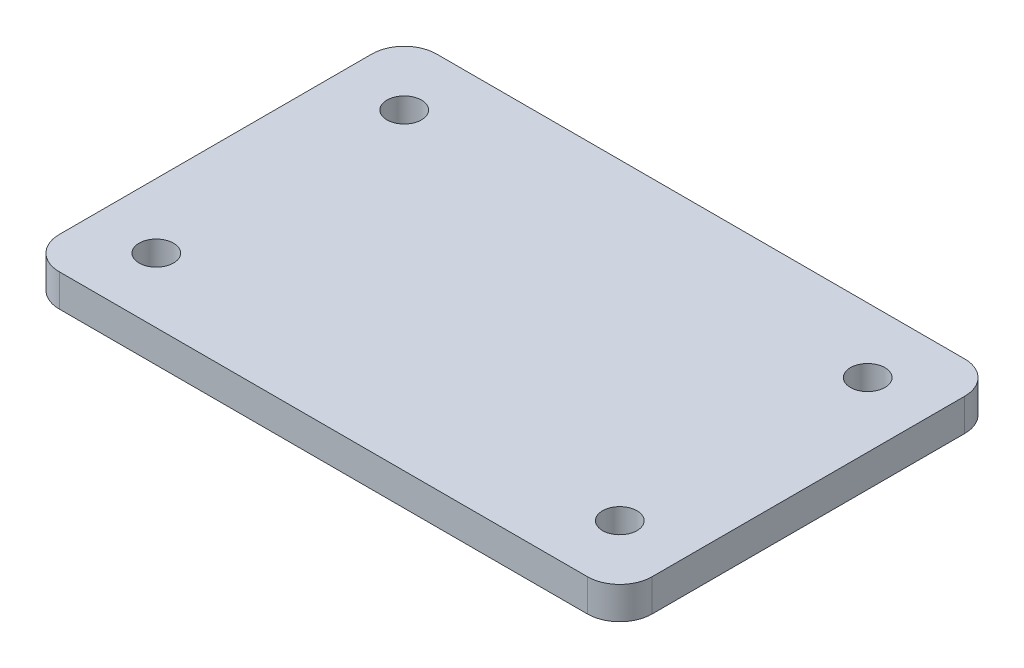
ISO-10303-21;
HEADER;
FILE_DESCRIPTION(('STEP AP214'),'2;1');
FILE_NAME('part.step','',(''),(''),'','','');
FILE_SCHEMA(('AUTOMOTIVE_DESIGN { 1 0 10303 214 1 1 1 1 }'));
ENDSEC;
DATA;
#1=APPLICATION_CONTEXT('core data for automotive mechanical design processes');
#2=APPLICATION_PROTOCOL_DEFINITION('international standard','automotive_design',2000,#1);
#3=PRODUCT_CONTEXT('',#1,'mechanical');
#4=PRODUCT('Part','Part','',(#3));
#5=PRODUCT_RELATED_PRODUCT_CATEGORY('part','',(#4));
#6=PRODUCT_DEFINITION_FORMATION('','',#4);
#7=PRODUCT_DEFINITION_CONTEXT('part definition',#1,'design');
#8=PRODUCT_DEFINITION('design','',#6,#7);
#9=PRODUCT_DEFINITION_SHAPE('','',#8);
#10=(LENGTH_UNIT() NAMED_UNIT(*) SI_UNIT(.MILLI.,.METRE.));
#11=(NAMED_UNIT(*) PLANE_ANGLE_UNIT() SI_UNIT($,.RADIAN.));
#12=(NAMED_UNIT(*) SI_UNIT($,.STERADIAN.) SOLID_ANGLE_UNIT());
#13=UNCERTAINTY_MEASURE_WITH_UNIT(LENGTH_MEASURE(1.E-05),#10,'distance_accuracy_value','');
#14=(GEOMETRIC_REPRESENTATION_CONTEXT(3) GLOBAL_UNCERTAINTY_ASSIGNED_CONTEXT((#13)) GLOBAL_UNIT_ASSIGNED_CONTEXT((#10,
#11,#12)) REPRESENTATION_CONTEXT('',''));
#15=CARTESIAN_POINT('',(0.,0.,0.));
#16=DIRECTION('',(0.,0.,1.));
#17=DIRECTION('',(1.,0.,0.));
#18=AXIS2_PLACEMENT_3D('',#15,#16,#17);
#19=CARTESIAN_POINT('',(0.,3.,0.));
#20=DIRECTION('',(1.,0.,0.));
#21=DIRECTION('',(0.,0.,-1.));
#22=AXIS2_PLACEMENT_3D('',#19,#20,#21);
#23=PLANE('',#22);
#24=DIRECTION('',(0.,0.,1.));
#25=VECTOR('',#24,1.);
#26=CARTESIAN_POINT('',(0.,3.,0.));
#27=LINE('',#26,#25);
#28=CARTESIAN_POINT('',(0.,3.,-32.));
#29=VERTEX_POINT('',#28);
#30=CARTESIAN_POINT('',(0.,3.,-3.));
#31=VERTEX_POINT('',#30);
#32=EDGE_CURVE('E135',#29,#31,#27,.T.);
#33=ORIENTED_EDGE('',*,*,#32,.F.);
#34=DIRECTION('',(0.,-1.,0.));
#35=VECTOR('',#34,1.);
#36=CARTESIAN_POINT('',(0.,3.,-32.));
#37=LINE('',#36,#35);
#38=CARTESIAN_POINT('',(0.,0.,-32.));
#39=VERTEX_POINT('',#38);
#40=EDGE_CURVE('E161',#29,#39,#37,.T.);
#41=ORIENTED_EDGE('',*,*,#40,.T.);
#42=DIRECTION('',(0.,0.,1.));
#43=VECTOR('',#42,1.);
#44=CARTESIAN_POINT('',(0.,0.,0.));
#45=LINE('',#44,#43);
#46=CARTESIAN_POINT('',(0.,0.,-3.));
#47=VERTEX_POINT('',#46);
#48=EDGE_CURVE('E167',#39,#47,#45,.T.);
#49=ORIENTED_EDGE('',*,*,#48,.T.);
#50=DIRECTION('',(0.,-1.,0.));
#51=VECTOR('',#50,1.);
#52=CARTESIAN_POINT('',(0.,3.,-3.));
#53=LINE('',#52,#51);
#54=EDGE_CURVE('E159',#47,#31,#53,.F.);
#55=ORIENTED_EDGE('',*,*,#54,.T.);
#56=EDGE_LOOP('',(#33,#41,#49,#55));
#57=FACE_BOUND('',#56,.T.);
#58=ADVANCED_FACE('F43',(#57),#23,.F.);
#59=CARTESIAN_POINT('',(0.,3.,0.));
#60=DIRECTION('',(0.,0.,-1.));
#61=DIRECTION('',(-1.,0.,0.));
#62=AXIS2_PLACEMENT_3D('',#59,#60,#61);
#63=PLANE('',#62);
#64=DIRECTION('',(1.,0.,0.));
#65=VECTOR('',#64,1.);
#66=CARTESIAN_POINT('',(0.,3.,0.));
#67=LINE('',#66,#65);
#68=CARTESIAN_POINT('',(3.,3.,0.));
#69=VERTEX_POINT('',#68);
#70=CARTESIAN_POINT('',(52.,3.,0.));
#71=VERTEX_POINT('',#70);
#72=EDGE_CURVE('E138',#69,#71,#67,.T.);
#73=ORIENTED_EDGE('',*,*,#72,.F.);
#74=DIRECTION('',(0.,-1.,0.));
#75=VECTOR('',#74,1.);
#76=CARTESIAN_POINT('',(3.,3.,0.));
#77=LINE('',#76,#75);
#78=CARTESIAN_POINT('',(3.,0.,0.));
#79=VERTEX_POINT('',#78);
#80=EDGE_CURVE('E11',#69,#79,#77,.T.);
#81=ORIENTED_EDGE('',*,*,#80,.T.);
#82=DIRECTION('',(1.,0.,0.));
#83=VECTOR('',#82,1.);
#84=CARTESIAN_POINT('',(0.,0.,0.));
#85=LINE('',#84,#83);
#86=CARTESIAN_POINT('',(52.,0.,0.));
#87=VERTEX_POINT('',#86);
#88=EDGE_CURVE('E140',#79,#87,#85,.T.);
#89=ORIENTED_EDGE('',*,*,#88,.T.);
#90=DIRECTION('',(0.,-1.,0.));
#91=VECTOR('',#90,1.);
#92=CARTESIAN_POINT('',(52.,3.,0.));
#93=LINE('',#92,#91);
#94=EDGE_CURVE('E51',#87,#71,#93,.F.);
#95=ORIENTED_EDGE('',*,*,#94,.T.);
#96=EDGE_LOOP('',(#73,#81,#89,#95));
#97=FACE_BOUND('',#96,.T.);
#98=ADVANCED_FACE('F218',(#97),#63,.F.);
#99=CARTESIAN_POINT('',(55.,3.,0.));
#100=DIRECTION('',(-1.,0.,0.));
#101=DIRECTION('',(0.,0.,1.));
#102=AXIS2_PLACEMENT_3D('',#99,#100,#101);
#103=PLANE('',#102);
#104=DIRECTION('',(0.,0.,-1.));
#105=VECTOR('',#104,1.);
#106=CARTESIAN_POINT('',(55.,0.,0.));
#107=LINE('',#106,#105);
#108=CARTESIAN_POINT('',(55.,0.,-3.));
#109=VERTEX_POINT('',#108);
#110=CARTESIAN_POINT('',(55.,0.,-32.));
#111=VERTEX_POINT('',#110);
#112=EDGE_CURVE('E136',#109,#111,#107,.T.);
#113=ORIENTED_EDGE('',*,*,#112,.T.);
#114=DIRECTION('',(0.,-1.,0.));
#115=VECTOR('',#114,1.);
#116=CARTESIAN_POINT('',(55.,3.,-32.));
#117=LINE('',#116,#115);
#118=CARTESIAN_POINT('',(55.,3.,-32.));
#119=VERTEX_POINT('',#118);
#120=EDGE_CURVE('E114',#111,#119,#117,.F.);
#121=ORIENTED_EDGE('',*,*,#120,.T.);
#122=DIRECTION('',(0.,0.,-1.));
#123=VECTOR('',#122,1.);
#124=CARTESIAN_POINT('',(55.,3.,0.));
#125=LINE('',#124,#123);
#126=CARTESIAN_POINT('',(55.,3.,-3.));
#127=VERTEX_POINT('',#126);
#128=EDGE_CURVE('E179',#127,#119,#125,.T.);
#129=ORIENTED_EDGE('',*,*,#128,.F.);
#130=DIRECTION('',(0.,-1.,0.));
#131=VECTOR('',#130,1.);
#132=CARTESIAN_POINT('',(55.,3.,-3.));
#133=LINE('',#132,#131);
#134=EDGE_CURVE('E119',#127,#109,#133,.T.);
#135=ORIENTED_EDGE('',*,*,#134,.T.);
#136=EDGE_LOOP('',(#113,#121,#129,#135));
#137=FACE_BOUND('',#136,.T.);
#138=ADVANCED_FACE('F216',(#137),#103,.F.);
#139=CARTESIAN_POINT('',(0.,3.,-35.));
#140=DIRECTION('',(0.,0.,1.));
#141=DIRECTION('',(1.,0.,0.));
#142=AXIS2_PLACEMENT_3D('',#139,#140,#141);
#143=PLANE('',#142);
#144=DIRECTION('',(-1.,0.,0.));
#145=VECTOR('',#144,1.);
#146=CARTESIAN_POINT('',(0.,3.,-35.));
#147=LINE('',#146,#145);
#148=CARTESIAN_POINT('',(52.,3.,-35.));
#149=VERTEX_POINT('',#148);
#150=CARTESIAN_POINT('',(3.,3.,-35.));
#151=VERTEX_POINT('',#150);
#152=EDGE_CURVE('E129',#149,#151,#147,.T.);
#153=ORIENTED_EDGE('',*,*,#152,.F.);
#154=DIRECTION('',(0.,-1.,0.));
#155=VECTOR('',#154,1.);
#156=CARTESIAN_POINT('',(52.,3.,-35.));
#157=LINE('',#156,#155);
#158=CARTESIAN_POINT('',(52.,0.,-35.));
#159=VERTEX_POINT('',#158);
#160=EDGE_CURVE('E113',#149,#159,#157,.T.);
#161=ORIENTED_EDGE('',*,*,#160,.T.);
#162=DIRECTION('',(-1.,0.,0.));
#163=VECTOR('',#162,1.);
#164=CARTESIAN_POINT('',(0.,0.,-35.));
#165=LINE('',#164,#163);
#166=CARTESIAN_POINT('',(3.,0.,-35.));
#167=VERTEX_POINT('',#166);
#168=EDGE_CURVE('E126',#159,#167,#165,.T.);
#169=ORIENTED_EDGE('',*,*,#168,.T.);
#170=DIRECTION('',(0.,-1.,0.));
#171=VECTOR('',#170,1.);
#172=CARTESIAN_POINT('',(3.,3.,-35.));
#173=LINE('',#172,#171);
#174=EDGE_CURVE('E131',#167,#151,#173,.F.);
#175=ORIENTED_EDGE('',*,*,#174,.T.);
#176=EDGE_LOOP('',(#153,#161,#169,#175));
#177=FACE_BOUND('',#176,.T.);
#178=ADVANCED_FACE('F125',(#177),#143,.F.);
#179=CARTESIAN_POINT('',(0.,3.,0.));
#180=DIRECTION('',(0.,-1.,0.));
#181=DIRECTION('',(0.,0.,-1.));
#182=AXIS2_PLACEMENT_3D('',#179,#180,#181);
#183=PLANE('',#182);
#184=CARTESIAN_POINT('',(6.,3.,-6.));
#185=DIRECTION('',(0.,1.,0.));
#186=DIRECTION('',(0.,0.,1.));
#187=AXIS2_PLACEMENT_3D('',#184,#185,#186);
#188=CIRCLE('',#187,1.6);
#189=CARTESIAN_POINT('',(6.,3.,-4.4));
#190=VERTEX_POINT('',#189);
#191=EDGE_CURVE('E189',#190,#190,#188,.T.);
#192=ORIENTED_EDGE('',*,*,#191,.F.);
#193=EDGE_LOOP('',(#192));
#194=FACE_BOUND('',#193,.T.);
#195=CARTESIAN_POINT('',(49.,3.,-6.));
#196=DIRECTION('',(0.,1.,0.));
#197=DIRECTION('',(0.,0.,1.));
#198=AXIS2_PLACEMENT_3D('',#195,#196,#197);
#199=CIRCLE('',#198,1.6);
#200=CARTESIAN_POINT('',(49.,3.,-4.4));
#201=VERTEX_POINT('',#200);
#202=EDGE_CURVE('E195',#201,#201,#199,.T.);
#203=ORIENTED_EDGE('',*,*,#202,.F.);
#204=EDGE_LOOP('',(#203));
#205=FACE_BOUND('',#204,.T.);
#206=CARTESIAN_POINT('',(49.,3.,-29.));
#207=DIRECTION('',(0.,1.,0.));
#208=DIRECTION('',(0.,0.,1.));
#209=AXIS2_PLACEMENT_3D('',#206,#207,#208);
#210=CIRCLE('',#209,1.6);
#211=CARTESIAN_POINT('',(49.,3.,-27.4));
#212=VERTEX_POINT('',#211);
#213=EDGE_CURVE('E184',#212,#212,#210,.T.);
#214=ORIENTED_EDGE('',*,*,#213,.F.);
#215=EDGE_LOOP('',(#214));
#216=FACE_BOUND('',#215,.T.);
#217=CARTESIAN_POINT('',(6.,3.,-29.));
#218=DIRECTION('',(0.,1.,0.));
#219=DIRECTION('',(0.,0.,1.));
#220=AXIS2_PLACEMENT_3D('',#217,#218,#219);
#221=CIRCLE('',#220,1.6);
#222=CARTESIAN_POINT('',(6.,3.,-27.4));
#223=VERTEX_POINT('',#222);
#224=EDGE_CURVE('E175',#223,#223,#221,.T.);
#225=ORIENTED_EDGE('',*,*,#224,.F.);
#226=EDGE_LOOP('',(#225));
#227=FACE_BOUND('',#226,.T.);
#228=ORIENTED_EDGE('',*,*,#128,.T.);
#229=CARTESIAN_POINT('',(52.,3.,-32.));
#230=DIRECTION('',(0.,-1.,0.));
#231=DIRECTION('',(0.,0.,-1.));
#232=AXIS2_PLACEMENT_3D('',#229,#230,#231);
#233=CIRCLE('',#232,3.);
#234=EDGE_CURVE('E157',#119,#149,#233,.F.);
#235=ORIENTED_EDGE('',*,*,#234,.T.);
#236=ORIENTED_EDGE('',*,*,#152,.T.);
#237=CARTESIAN_POINT('',(3.,3.,-32.));
#238=DIRECTION('',(0.,-1.,0.));
#239=DIRECTION('',(0.,0.,-1.));
#240=AXIS2_PLACEMENT_3D('',#237,#238,#239);
#241=CIRCLE('',#240,3.);
#242=EDGE_CURVE('E155',#151,#29,#241,.F.);
#243=ORIENTED_EDGE('',*,*,#242,.T.);
#244=ORIENTED_EDGE('',*,*,#32,.T.);
#245=CARTESIAN_POINT('',(3.,3.,-3.));
#246=DIRECTION('',(0.,-1.,0.));
#247=DIRECTION('',(0.,0.,-1.));
#248=AXIS2_PLACEMENT_3D('',#245,#246,#247);
#249=CIRCLE('',#248,3.);
#250=EDGE_CURVE('E64',#31,#69,#249,.F.);
#251=ORIENTED_EDGE('',*,*,#250,.T.);
#252=ORIENTED_EDGE('',*,*,#72,.T.);
#253=CARTESIAN_POINT('',(52.,3.,-3.));
#254=DIRECTION('',(0.,-1.,0.));
#255=DIRECTION('',(0.,0.,-1.));
#256=AXIS2_PLACEMENT_3D('',#253,#254,#255);
#257=CIRCLE('',#256,3.);
#258=EDGE_CURVE('E152',#71,#127,#257,.F.);
#259=ORIENTED_EDGE('',*,*,#258,.T.);
#260=EDGE_LOOP('',(#228,#235,#236,#243,#244,#251,#252,#259));
#261=FACE_BOUND('',#260,.T.);
#262=ADVANCED_FACE('F206',(#194,#205,#216,#227,#261),#183,.F.);
#263=CARTESIAN_POINT('',(0.,0.,0.));
#264=DIRECTION('',(0.,-1.,0.));
#265=DIRECTION('',(0.,0.,-1.));
#266=AXIS2_PLACEMENT_3D('',#263,#264,#265);
#267=PLANE('',#266);
#268=CARTESIAN_POINT('',(6.,0.,-6.));
#269=DIRECTION('',(0.,1.,0.));
#270=DIRECTION('',(0.,0.,1.));
#271=AXIS2_PLACEMENT_3D('',#268,#269,#270);
#272=CIRCLE('',#271,1.6);
#273=CARTESIAN_POINT('',(6.,0.,-4.4));
#274=VERTEX_POINT('',#273);
#275=EDGE_CURVE('E186',#274,#274,#272,.T.);
#276=ORIENTED_EDGE('',*,*,#275,.T.);
#277=EDGE_LOOP('',(#276));
#278=FACE_BOUND('',#277,.T.);
#279=CARTESIAN_POINT('',(49.,0.,-6.));
#280=DIRECTION('',(0.,1.,0.));
#281=DIRECTION('',(0.,0.,1.));
#282=AXIS2_PLACEMENT_3D('',#279,#280,#281);
#283=CIRCLE('',#282,1.6);
#284=CARTESIAN_POINT('',(49.,0.,-4.4));
#285=VERTEX_POINT('',#284);
#286=EDGE_CURVE('E192',#285,#285,#283,.T.);
#287=ORIENTED_EDGE('',*,*,#286,.T.);
#288=EDGE_LOOP('',(#287));
#289=FACE_BOUND('',#288,.T.);
#290=CARTESIAN_POINT('',(49.,0.,-29.));
#291=DIRECTION('',(0.,1.,0.));
#292=DIRECTION('',(0.,0.,1.));
#293=AXIS2_PLACEMENT_3D('',#290,#291,#292);
#294=CIRCLE('',#293,1.6);
#295=CARTESIAN_POINT('',(49.,0.,-27.4));
#296=VERTEX_POINT('',#295);
#297=EDGE_CURVE('E198',#296,#296,#294,.T.);
#298=ORIENTED_EDGE('',*,*,#297,.T.);
#299=EDGE_LOOP('',(#298));
#300=FACE_BOUND('',#299,.T.);
#301=CARTESIAN_POINT('',(6.,0.,-29.));
#302=DIRECTION('',(0.,1.,0.));
#303=DIRECTION('',(0.,0.,1.));
#304=AXIS2_PLACEMENT_3D('',#301,#302,#303);
#305=CIRCLE('',#304,1.6);
#306=CARTESIAN_POINT('',(6.,0.,-27.4));
#307=VERTEX_POINT('',#306);
#308=EDGE_CURVE('E172',#307,#307,#305,.T.);
#309=ORIENTED_EDGE('',*,*,#308,.T.);
#310=EDGE_LOOP('',(#309));
#311=FACE_BOUND('',#310,.T.);
#312=ORIENTED_EDGE('',*,*,#168,.F.);
#313=CARTESIAN_POINT('',(52.,0.,-32.));
#314=DIRECTION('',(0.,-1.,0.));
#315=DIRECTION('',(0.,0.,-1.));
#316=AXIS2_PLACEMENT_3D('',#313,#314,#315);
#317=CIRCLE('',#316,3.);
#318=EDGE_CURVE('E109',#159,#111,#317,.T.);
#319=ORIENTED_EDGE('',*,*,#318,.T.);
#320=ORIENTED_EDGE('',*,*,#112,.F.);
#321=CARTESIAN_POINT('',(52.,0.,-3.));
#322=DIRECTION('',(0.,-1.,0.));
#323=DIRECTION('',(0.,0.,-1.));
#324=AXIS2_PLACEMENT_3D('',#321,#322,#323);
#325=CIRCLE('',#324,3.);
#326=EDGE_CURVE('E130',#109,#87,#325,.T.);
#327=ORIENTED_EDGE('',*,*,#326,.T.);
#328=ORIENTED_EDGE('',*,*,#88,.F.);
#329=CARTESIAN_POINT('',(3.,0.,-3.));
#330=DIRECTION('',(0.,-1.,0.));
#331=DIRECTION('',(0.,0.,-1.));
#332=AXIS2_PLACEMENT_3D('',#329,#330,#331);
#333=CIRCLE('',#332,3.);
#334=EDGE_CURVE('E146',#79,#47,#333,.T.);
#335=ORIENTED_EDGE('',*,*,#334,.T.);
#336=ORIENTED_EDGE('',*,*,#48,.F.);
#337=CARTESIAN_POINT('',(3.,0.,-32.));
#338=DIRECTION('',(0.,-1.,0.));
#339=DIRECTION('',(0.,0.,-1.));
#340=AXIS2_PLACEMENT_3D('',#337,#338,#339);
#341=CIRCLE('',#340,3.);
#342=EDGE_CURVE('E120',#39,#167,#341,.T.);
#343=ORIENTED_EDGE('',*,*,#342,.T.);
#344=EDGE_LOOP('',(#312,#319,#320,#327,#328,#335,#336,#343));
#345=FACE_BOUND('',#344,.T.);
#346=ADVANCED_FACE('F133',(#278,#289,#300,#311,#345),#267,.T.);
#347=CARTESIAN_POINT('',(6.,0.,-29.));
#348=DIRECTION('',(0.,1.,0.));
#349=DIRECTION('',(0.,0.,1.));
#350=AXIS2_PLACEMENT_3D('',#347,#348,#349);
#351=CYLINDRICAL_SURFACE('',#350,1.6);
#352=ORIENTED_EDGE('',*,*,#308,.F.);
#353=EDGE_LOOP('',(#352));
#354=FACE_BOUND('',#353,.T.);
#355=ORIENTED_EDGE('',*,*,#224,.T.);
#356=EDGE_LOOP('',(#355));
#357=FACE_BOUND('',#356,.T.);
#358=ADVANCED_FACE('F244',(#354,#357),#351,.F.);
#359=CARTESIAN_POINT('',(49.,0.,-29.));
#360=DIRECTION('',(0.,1.,0.));
#361=DIRECTION('',(0.,0.,1.));
#362=AXIS2_PLACEMENT_3D('',#359,#360,#361);
#363=CYLINDRICAL_SURFACE('',#362,1.6);
#364=ORIENTED_EDGE('',*,*,#297,.F.);
#365=EDGE_LOOP('',(#364));
#366=FACE_BOUND('',#365,.T.);
#367=ORIENTED_EDGE('',*,*,#213,.T.);
#368=EDGE_LOOP('',(#367));
#369=FACE_BOUND('',#368,.T.);
#370=ADVANCED_FACE('F204',(#366,#369),#363,.F.);
#371=CARTESIAN_POINT('',(49.,0.,-6.));
#372=DIRECTION('',(0.,1.,0.));
#373=DIRECTION('',(0.,0.,1.));
#374=AXIS2_PLACEMENT_3D('',#371,#372,#373);
#375=CYLINDRICAL_SURFACE('',#374,1.6);
#376=ORIENTED_EDGE('',*,*,#286,.F.);
#377=EDGE_LOOP('',(#376));
#378=FACE_BOUND('',#377,.T.);
#379=ORIENTED_EDGE('',*,*,#202,.T.);
#380=EDGE_LOOP('',(#379));
#381=FACE_BOUND('',#380,.T.);
#382=ADVANCED_FACE('F251',(#378,#381),#375,.F.);
#383=CARTESIAN_POINT('',(6.,0.,-6.));
#384=DIRECTION('',(0.,1.,0.));
#385=DIRECTION('',(0.,0.,1.));
#386=AXIS2_PLACEMENT_3D('',#383,#384,#385);
#387=CYLINDRICAL_SURFACE('',#386,1.6);
#388=ORIENTED_EDGE('',*,*,#275,.F.);
#389=EDGE_LOOP('',(#388));
#390=FACE_BOUND('',#389,.T.);
#391=ORIENTED_EDGE('',*,*,#191,.T.);
#392=EDGE_LOOP('',(#391));
#393=FACE_BOUND('',#392,.T.);
#394=ADVANCED_FACE('F229',(#390,#393),#387,.F.);
#395=CARTESIAN_POINT('',(52.,3.,-32.));
#396=DIRECTION('',(0.,-1.,0.));
#397=DIRECTION('',(0.,0.,-1.));
#398=AXIS2_PLACEMENT_3D('',#395,#396,#397);
#399=CYLINDRICAL_SURFACE('',#398,3.);
#400=ORIENTED_EDGE('',*,*,#234,.F.);
#401=ORIENTED_EDGE('',*,*,#120,.F.);
#402=ORIENTED_EDGE('',*,*,#318,.F.);
#403=ORIENTED_EDGE('',*,*,#160,.F.);
#404=EDGE_LOOP('',(#400,#401,#402,#403));
#405=FACE_BOUND('',#404,.T.);
#406=ADVANCED_FACE('F112',(#405),#399,.T.);
#407=CARTESIAN_POINT('',(3.,3.,-32.));
#408=DIRECTION('',(0.,-1.,0.));
#409=DIRECTION('',(0.,0.,-1.));
#410=AXIS2_PLACEMENT_3D('',#407,#408,#409);
#411=CYLINDRICAL_SURFACE('',#410,3.);
#412=ORIENTED_EDGE('',*,*,#242,.F.);
#413=ORIENTED_EDGE('',*,*,#174,.F.);
#414=ORIENTED_EDGE('',*,*,#342,.F.);
#415=ORIENTED_EDGE('',*,*,#40,.F.);
#416=EDGE_LOOP('',(#412,#413,#414,#415));
#417=FACE_BOUND('',#416,.T.);
#418=ADVANCED_FACE('F222',(#417),#411,.T.);
#419=CARTESIAN_POINT('',(3.,3.,-3.));
#420=DIRECTION('',(0.,-1.,0.));
#421=DIRECTION('',(0.,0.,-1.));
#422=AXIS2_PLACEMENT_3D('',#419,#420,#421);
#423=CYLINDRICAL_SURFACE('',#422,3.);
#424=ORIENTED_EDGE('',*,*,#250,.F.);
#425=ORIENTED_EDGE('',*,*,#54,.F.);
#426=ORIENTED_EDGE('',*,*,#334,.F.);
#427=ORIENTED_EDGE('',*,*,#80,.F.);
#428=EDGE_LOOP('',(#424,#425,#426,#427));
#429=FACE_BOUND('',#428,.T.);
#430=ADVANCED_FACE('F221',(#429),#423,.T.);
#431=CARTESIAN_POINT('',(52.,3.,-3.));
#432=DIRECTION('',(0.,-1.,0.));
#433=DIRECTION('',(0.,0.,-1.));
#434=AXIS2_PLACEMENT_3D('',#431,#432,#433);
#435=CYLINDRICAL_SURFACE('',#434,3.);
#436=ORIENTED_EDGE('',*,*,#258,.F.);
#437=ORIENTED_EDGE('',*,*,#94,.F.);
#438=ORIENTED_EDGE('',*,*,#326,.F.);
#439=ORIENTED_EDGE('',*,*,#134,.F.);
#440=EDGE_LOOP('',(#436,#437,#438,#439));
#441=FACE_BOUND('',#440,.T.);
#442=ADVANCED_FACE('F45',(#441),#435,.T.);
#443=CLOSED_SHELL('',(#58,#98,#138,#178,#262,#346,#358,#370,#382,#394,#406,#418,#430,#442));
#444=MANIFOLD_SOLID_BREP('B2',#443);
#445=ADVANCED_BREP_SHAPE_REPRESENTATION('',(#18,#444),#14);
#446=SHAPE_DEFINITION_REPRESENTATION(#9,#445);
ENDSEC;
END-ISO-10303-21;
